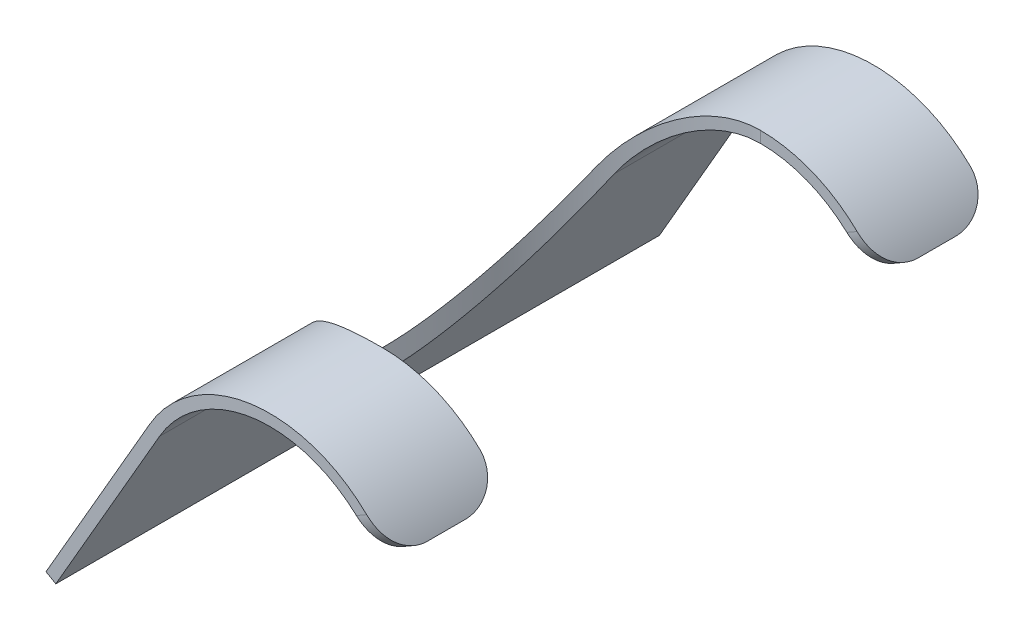
ISO-10303-21;
HEADER;
FILE_DESCRIPTION(('STEP AP214'),'2;1');
FILE_NAME('part.step','',(''),(''),'','','');
FILE_SCHEMA(('AUTOMOTIVE_DESIGN { 1 0 10303 214 1 1 1 1 }'));
ENDSEC;
DATA;
#1=APPLICATION_CONTEXT('core data for automotive mechanical design processes');
#2=APPLICATION_PROTOCOL_DEFINITION('international standard','automotive_design',2000,#1);
#3=PRODUCT_CONTEXT('',#1,'mechanical');
#4=PRODUCT('Part','Part','',(#3));
#5=PRODUCT_RELATED_PRODUCT_CATEGORY('part','',(#4));
#6=PRODUCT_DEFINITION_FORMATION('','',#4);
#7=PRODUCT_DEFINITION_CONTEXT('part definition',#1,'design');
#8=PRODUCT_DEFINITION('design','',#6,#7);
#9=PRODUCT_DEFINITION_SHAPE('','',#8);
#10=(LENGTH_UNIT() NAMED_UNIT(*) SI_UNIT(.MILLI.,.METRE.));
#11=(NAMED_UNIT(*) PLANE_ANGLE_UNIT() SI_UNIT($,.RADIAN.));
#12=(NAMED_UNIT(*) SI_UNIT($,.STERADIAN.) SOLID_ANGLE_UNIT());
#13=UNCERTAINTY_MEASURE_WITH_UNIT(LENGTH_MEASURE(1.E-05),#10,'distance_accuracy_value','');
#14=(GEOMETRIC_REPRESENTATION_CONTEXT(3) GLOBAL_UNCERTAINTY_ASSIGNED_CONTEXT((#13)) GLOBAL_UNIT_ASSIGNED_CONTEXT((#10,
#11,#12)) REPRESENTATION_CONTEXT('',''));
#15=CARTESIAN_POINT('',(0.,0.,0.));
#16=DIRECTION('',(0.,0.,1.));
#17=DIRECTION('',(1.,0.,0.));
#18=AXIS2_PLACEMENT_3D('',#15,#16,#17);
#19=CARTESIAN_POINT('',(-0.500000002018825,7.15593873729671,8.94999999594887));
#20=DIRECTION('',(0.866025403788329,0.499999999993262,0.));
#21=DIRECTION('',(-0.499999999993262,0.866025403788329,0.));
#22=AXIS2_PLACEMENT_3D('',#19,#20,#21);
#23=CYLINDRICAL_SURFACE('',#22,1.00000000405113);
#24=CARTESIAN_POINT('',(2.565077026811,8.92556178494675,9.95));
#25=CARTESIAN_POINT('',(2.58516809545274,8.90600763539458,9.94999981776028));
#26=CARTESIAN_POINT('',(2.6050255348985,8.88622858775811,9.94890721494167));
#27=CARTESIAN_POINT('',(2.64416777003485,8.84634663350885,9.9445059037748));
#28=CARTESIAN_POINT('',(2.66345246111897,8.82624366875768,9.94119679317263));
#29=CARTESIAN_POINT('',(2.72023571833599,8.76569422711802,9.92790836840913));
#30=CARTESIAN_POINT('',(2.75670926997416,8.72496251733051,9.91456809533114));
#31=CARTESIAN_POINT('',(2.82600738758244,8.64417500583196,9.87901547746584));
#32=CARTESIAN_POINT('',(2.85882595104903,8.60412040500736,9.85678880565354));
#33=CARTESIAN_POINT('',(2.92010158941397,8.52628975555175,9.80396854300699));
#34=CARTESIAN_POINT('',(2.94856116028593,8.48851241052897,9.77337976849734));
#35=CARTESIAN_POINT('',(3.00024548200024,8.41741273845879,9.7053165134745));
#36=CARTESIAN_POINT('',(3.02355878256153,8.38401986788639,9.66798266975452));
#37=CARTESIAN_POINT('',(3.06547159989256,8.32216038748116,9.58707963203411));
#38=CARTESIAN_POINT('',(3.08406928748245,8.29369569063405,9.54350802863754));
#39=CARTESIAN_POINT('',(3.1166496565136,8.24262915622129,9.45100255449274));
#40=CARTESIAN_POINT('',(3.13059561191909,8.22007426326099,9.40202989360018));
#41=CARTESIAN_POINT('',(3.15373295200845,8.18202621614994,9.30037673852736));
#42=CARTESIAN_POINT('',(3.16292714460175,8.16652889218879,9.24769845503039));
#43=CARTESIAN_POINT('',(3.17430768237019,8.14718138458603,9.15847258593843));
#44=CARTESIAN_POINT('',(3.17781432909695,8.14116195735259,9.12254285323024));
#45=CARTESIAN_POINT('',(3.18281243475992,8.13254739042067,9.05018851961782));
#46=CARTESIAN_POINT('',(3.18430672275449,8.12994744359368,9.01376468630897));
#47=CARTESIAN_POINT('',(3.18480762,8.1290923,8.97727016284814));
#48=B_SPLINE_CURVE_WITH_KNOTS('',3,(#24,#25,#26,#27,#28,#29,#30,#31,#32,#33,#34,#35,#36,#37,#38,
#39,#40,#41,#42,#43,#44,#45,#46,#47),.UNSPECIFIED.,.F.,.F.,(4,2,2,2,2,2,2,2,2,2,2,4),(0.,
0.0840620784626981,0.168139416725162,0.336104507417472,0.504341497595178,0.672481791646433,
0.837453219375705,1.00248854173718,1.168797593254,1.33500825681516,1.44460043975254,
1.55403839199924),.UNSPECIFIED.);
#49=CARTESIAN_POINT('',(2.565077026811,8.92556178494675,9.95));
#50=VERTEX_POINT('',#49);
#51=CARTESIAN_POINT('',(3.18480762,8.1290923,8.97727016284814));
#52=VERTEX_POINT('',#51);
#53=EDGE_CURVE('E235',#50,#52,#48,.T.);
#54=ORIENTED_EDGE('',*,*,#53,.F.);
#55=DIRECTION('',(0.866025403788326,0.499999999993268,0.));
#56=VECTOR('',#55,1.);
#57=CARTESIAN_POINT('',(2.29414062631406,8.76913658118938,9.95));
#58=LINE('',#57,#56);
#59=CARTESIAN_POINT('',(2.29414062631406,8.76913658118939,9.95));
#60=VERTEX_POINT('',#59);
#61=EDGE_CURVE('E141',#60,#50,#58,.T.);
#62=ORIENTED_EDGE('',*,*,#61,.F.);
#63=CARTESIAN_POINT('',(2.29414062631406,8.76913658118939,9.95));
#64=CARTESIAN_POINT('',(2.31470466713574,8.75010663757751,9.94999980919821));
#65=CARTESIAN_POINT('',(2.33502197653587,8.73082493689715,9.94892472355817));
#66=CARTESIAN_POINT('',(2.3750567268426,8.69188068724999,9.94458585488635));
#67=CARTESIAN_POINT('',(2.39477403405678,8.67221805497848,9.94132158774079));
#68=CARTESIAN_POINT('',(2.45281302404892,8.61289628624455,9.92819631151513));
#69=CARTESIAN_POINT('',(2.49006443620208,8.57286369766963,9.91500298135455));
#70=CARTESIAN_POINT('',(2.56078281480242,8.49323620163832,9.87976554641829));
#71=CARTESIAN_POINT('',(2.59424276812504,8.45364222366939,9.85770537234944));
#72=CARTESIAN_POINT('',(2.65664204394035,8.37653841372539,9.80520899426906));
#73=CARTESIAN_POINT('',(2.68558427895494,8.33902724911928,9.77477822193786));
#74=CARTESIAN_POINT('',(2.73798977189637,8.26842438109076,9.70712230448634));
#75=CARTESIAN_POINT('',(2.76156046422259,8.23525300995497,9.67006311820635));
#76=CARTESIAN_POINT('',(2.80390712805695,8.17369197517111,9.58972569211003));
#77=CARTESIAN_POINT('',(2.8226811226684,8.14530428469058,9.54644489958559));
#78=CARTESIAN_POINT('',(2.85558727262856,8.09424283530653,9.4544748625279));
#79=CARTESIAN_POINT('',(2.86967678220606,8.07162198690413,9.40574105434958));
#80=CARTESIAN_POINT('',(2.89307871074019,8.03335767031896,9.30454710639832));
#81=CARTESIAN_POINT('',(2.9023937784171,8.01771033406638,9.25208905115988));
#82=CARTESIAN_POINT('',(2.91409136079476,7.9978725929767,9.16234423309766));
#83=CARTESIAN_POINT('',(2.91774275914898,7.99161186346191,9.1256614131251));
#84=CARTESIAN_POINT('',(2.92293948820761,7.98266039556129,9.05176630382768));
#85=CARTESIAN_POINT('',(2.92448765890273,7.97996484324297,9.01455479717664));
#86=CARTESIAN_POINT('',(2.92499999992881,7.97909230012332,8.97727014717361));
#87=B_SPLINE_CURVE_WITH_KNOTS('',3,(#63,#64,#65,#66,#67,#68,#69,#70,#71,#72,#73,#74,#75,#76,#77,
#78,#79,#80,#81,#82,#83,#84,#85,#86),.UNSPECIFIED.,.F.,.F.,(4,2,2,2,2,2,2,2,2,2,2,4),(0.,
0.084009682875824,0.168037949711854,0.335922055763564,0.50411179833154,0.672192659011948,
0.836539519331454,1.00095400421219,1.1668266994067,1.33260727342322,1.44456412458009,
1.556369649509),.UNSPECIFIED.);
#88=CARTESIAN_POINT('',(2.925,7.9790923,8.97727015240105));
#89=VERTEX_POINT('',#88);
#90=EDGE_CURVE('E158',#60,#89,#87,.T.);
#91=ORIENTED_EDGE('',*,*,#90,.T.);
#92=DIRECTION('',(0.866025402838329,0.500000001638711,0.));
#93=VECTOR('',#92,1.);
#94=CARTESIAN_POINT('',(3.05490381,8.0540923,8.97727016284814));
#95=LINE('',#94,#93);
#96=EDGE_CURVE('E136',#52,#89,#95,.F.);
#97=ORIENTED_EDGE('',*,*,#96,.F.);
#98=EDGE_LOOP('',(#54,#62,#91,#97));
#99=FACE_BOUND('',#98,.T.);
#100=ADVANCED_FACE('F17',(#99),#23,.T.);
#101=CARTESIAN_POINT('',(3.05490381,8.0540923,6.95));
#102=DIRECTION('',(0.500000001638711,-0.866025402838329,0.));
#103=DIRECTION('',(0.866025402838329,0.500000001638711,0.));
#104=AXIS2_PLACEMENT_3D('',#101,#102,#103);
#105=PLANE('',#104);
#106=DIRECTION('',(0.866025403788329,0.499999999993262,0.));
#107=VECTOR('',#106,1.);
#108=CARTESIAN_POINT('',(-0.00018595007735228,6.29023540498166,7.92272983715184));
#109=LINE('',#108,#107);
#110=CARTESIAN_POINT('',(3.18480762,8.1290923,7.92272983715184));
#111=VERTEX_POINT('',#110);
#112=CARTESIAN_POINT('',(2.9249999998575,7.97909230024682,7.92272984759895));
#113=VERTEX_POINT('',#112);
#114=EDGE_CURVE('E134',#111,#113,#109,.F.);
#115=ORIENTED_EDGE('',*,*,#114,.F.);
#116=DIRECTION('',(0.,0.,1.));
#117=VECTOR('',#116,1.);
#118=CARTESIAN_POINT('',(3.18480762,8.1290923,6.95));
#119=LINE('',#118,#117);
#120=EDGE_CURVE('E350',#52,#111,#119,.F.);
#121=ORIENTED_EDGE('',*,*,#120,.F.);
#122=ORIENTED_EDGE('',*,*,#96,.T.);
#123=DIRECTION('',(0.,0.,1.));
#124=VECTOR('',#123,1.);
#125=CARTESIAN_POINT('',(2.925,7.9790923,6.95));
#126=LINE('',#125,#124);
#127=EDGE_CURVE('E130',#89,#113,#126,.F.);
#128=ORIENTED_EDGE('',*,*,#127,.T.);
#129=EDGE_LOOP('',(#115,#121,#122,#128));
#130=FACE_BOUND('',#129,.T.);
#131=ADVANCED_FACE('F132',(#130),#105,.T.);
#132=CARTESIAN_POINT('',(-0.500000002018825,7.15593873729671,7.95000000405113));
#133=DIRECTION('',(0.866025403788329,0.499999999993262,0.));
#134=DIRECTION('',(-0.499999999993262,0.866025403788329,0.));
#135=AXIS2_PLACEMENT_3D('',#132,#133,#134);
#136=CYLINDRICAL_SURFACE('',#135,1.00000000405113);
#137=CARTESIAN_POINT('',(2.925,7.9790923,7.92272985804603));
#138=CARTESIAN_POINT('',(2.92461497710748,7.97975515604013,7.89463744421071));
#139=CARTESIAN_POINT('',(2.92364129755823,7.98144555683753,7.8665907957685));
#140=CARTESIAN_POINT('',(2.92050606186785,7.98685589158635,7.81076212598566));
#141=CARTESIAN_POINT('',(2.91834455611979,7.9905757394392,7.78298009346966));
#142=CARTESIAN_POINT('',(2.91007027059447,8.00472776247862,7.70036621662128));
#143=CARTESIAN_POINT('',(2.90216667156712,8.01815447775995,7.64618483705058));
#144=CARTESIAN_POINT('',(2.88148244911195,8.05243116735539,7.54120303947536));
#145=CARTESIAN_POINT('',(2.86869916335391,8.07328519355271,7.4904044849221));
#146=CARTESIAN_POINT('',(2.83814154681834,8.12153496046762,7.39364641862384));
#147=CARTESIAN_POINT('',(2.82036824489102,8.14892935250717,7.34768591204469));
#148=CARTESIAN_POINT('',(2.77986290743148,8.2089788437428,7.26211961387637));
#149=CARTESIAN_POINT('',(2.75715261084649,8.24161072100354,7.2224872445201));
#150=CARTESIAN_POINT('',(2.70681771461486,8.31085378802713,7.15048248779734));
#151=CARTESIAN_POINT('',(2.6791936389639,8.34746455332745,7.11810932715452));
#152=CARTESIAN_POINT('',(2.6198077863755,8.42256274633294,7.06194534020721));
#153=CARTESIAN_POINT('',(2.58811539511097,8.46101312393063,7.03803137350619));
#154=CARTESIAN_POINT('',(2.52082114536811,8.53880890752856,6.99863980094296));
#155=CARTESIAN_POINT('',(2.48521995202751,8.57815416035255,6.98316076242387));
#156=CARTESIAN_POINT('',(2.42356885086644,8.64301880940114,6.96460584850809));
#157=CARTESIAN_POINT('',(2.39838097757642,8.66869599993407,6.95910304978404));
#158=CARTESIAN_POINT('',(2.34697796890161,8.71943879272163,6.95180125355583));
#159=CARTESIAN_POINT('',(2.32076503058625,8.74450553424768,6.94999473416754));
#160=CARTESIAN_POINT('',(2.29414062942669,8.76913657830862,6.95));
#161=B_SPLINE_CURVE_WITH_KNOTS('',3,(#137,#138,#139,#140,#141,#142,#143,#144,#145,#146,#147,
#148,#149,#150,#151,#152,#153,#154,#155,#156,#157,#158,#159,#160),.UNSPECIFIED.,.F.,.F.,(4,2,2,
2,2,2,2,2,2,2,2,4),(0.,0.0842568981871175,0.168510222083505,0.336774620485421,0.505130954536078,
0.673452602044459,0.841047576608336,1.00862468987845,1.17365091642329,1.33864910482669,
1.447615814944,1.55636055767743),.UNSPECIFIED.);
#162=CARTESIAN_POINT('',(2.29414062942669,8.76913657830862,6.95));
#163=VERTEX_POINT('',#162);
#164=EDGE_CURVE('E21',#113,#163,#161,.T.);
#165=ORIENTED_EDGE('',*,*,#164,.T.);
#166=DIRECTION('',(0.866025403788329,0.499999999993262,0.));
#167=VECTOR('',#166,1.);
#168=CARTESIAN_POINT('',(-0.499999999993259,7.15593873378833,6.95));
#169=LINE('',#168,#167);
#170=CARTESIAN_POINT('',(2.56507702982753,8.92556178201051,6.95));
#171=VERTEX_POINT('',#170);
#172=EDGE_CURVE('E150',#163,#171,#169,.T.);
#173=ORIENTED_EDGE('',*,*,#172,.T.);
#174=CARTESIAN_POINT('',(3.18480762,8.1290923,7.92272983715184));
#175=CARTESIAN_POINT('',(3.18442267042778,8.12975535445328,7.89463246129579));
#176=CARTESIAN_POINT('',(3.18344857534899,8.13144615648752,7.86658086607313));
#177=CARTESIAN_POINT('',(3.18031307634577,8.13685857261385,7.81074245438584));
#178=CARTESIAN_POINT('',(3.17815172381244,8.14058009880486,7.78295562651356));
#179=CARTESIAN_POINT('',(3.16988123634562,8.15474008188111,7.70032944490068));
#180=CARTESIAN_POINT('',(3.16198458864293,8.16817604456149,7.64614083511628));
#181=CARTESIAN_POINT('',(3.14134906528023,8.20249399207234,7.54114624616715));
#182=CARTESIAN_POINT('',(3.12860759482848,8.2233799666108,7.49034209681819));
#183=CARTESIAN_POINT('',(3.09820579093022,8.27173946629904,7.39357237216359));
#184=CARTESIAN_POINT('',(3.08054645903183,8.29921164997467,7.34760581428089));
#185=CARTESIAN_POINT('',(3.04036783070082,8.35951336318717,7.26199431494545));
#186=CARTESIAN_POINT('',(3.01786651413188,8.39232296603361,7.22232690511095));
#187=CARTESIAN_POINT('',(2.96808807634847,8.46204310516683,7.15025193723569));
#188=CARTESIAN_POINT('',(2.94081120324343,8.49895342836825,7.11784400223522));
#189=CARTESIAN_POINT('',(2.88220118282138,8.57489634428194,7.06155100894152));
#190=CARTESIAN_POINT('',(2.85092468363286,8.61389555756343,7.03756174905091));
#191=CARTESIAN_POINT('',(2.78460101774433,8.69297742311017,6.99809008375617));
#192=CARTESIAN_POINT('',(2.7495548482208,8.7330597867634,6.98260543524519));
#193=CARTESIAN_POINT('',(2.68942655074896,8.79877101017756,6.9642792297853));
#194=CARTESIAN_POINT('',(2.66519566409774,8.82450594716837,6.95890401695498));
#195=CARTESIAN_POINT('',(2.61579291579234,8.87547224165768,6.95176570704237));
#196=CARTESIAN_POINT('',(2.59062301160846,8.90070449509861,6.94999548131208));
#197=CARTESIAN_POINT('',(2.56507702982753,8.92556178201051,6.95));
#198=B_SPLINE_CURVE_WITH_KNOTS('',3,(#174,#175,#176,#177,#178,#179,#180,#181,#182,#183,#184,
#185,#186,#187,#188,#189,#190,#191,#192,#193,#194,#195,#196,#197),.UNSPECIFIED.,.F.,.F.,(4,2,2,
2,2,2,2,2,2,2,2,4),(0.,0.0842717694749957,0.168539891486708,0.336828547388573,0.505207462627632,
0.673552111668573,0.841282109500406,1.00900339566692,1.17456872368317,1.34009036254438,
1.447166292486,1.55403027972248),.UNSPECIFIED.);
#199=EDGE_CURVE('E148',#111,#171,#198,.T.);
#200=ORIENTED_EDGE('',*,*,#199,.F.);
#201=ORIENTED_EDGE('',*,*,#114,.T.);
#202=EDGE_LOOP('',(#165,#173,#200,#201));
#203=FACE_BOUND('',#202,.T.);
#204=ADVANCED_FACE('F145',(#203),#136,.T.);
#205=CARTESIAN_POINT('',(5.,6.5,9.95));
#206=DIRECTION('',(0.,0.,1.));
#207=DIRECTION('',(1.,0.,0.));
#208=AXIS2_PLACEMENT_3D('',#205,#206,#207);
#209=PLANE('',#208);
#210=DIRECTION('',(0.,1.,0.));
#211=VECTOR('',#210,1.);
#212=CARTESIAN_POINT('',(0.,6.5,9.95));
#213=LINE('',#212,#211);
#214=CARTESIAN_POINT('',(0.,9.96784184,9.95));
#215=VERTEX_POINT('',#214);
#216=CARTESIAN_POINT('',(0.,9.66784184,9.95));
#217=VERTEX_POINT('',#216);
#218=EDGE_CURVE('E194',#215,#217,#213,.F.);
#219=ORIENTED_EDGE('',*,*,#218,.T.);
#220=CARTESIAN_POINT('',(0.,6.29034276786103,9.95));
#221=DIRECTION('',(0.,0.,1.));
#222=DIRECTION('',(1.,0.,0.));
#223=AXIS2_PLACEMENT_3D('',#220,#221,#222);
#224=CIRCLE('',#223,3.37749907213897);
#225=EDGE_CURVE('E156',#217,#60,#224,.F.);
#226=ORIENTED_EDGE('',*,*,#225,.T.);
#227=ORIENTED_EDGE('',*,*,#61,.T.);
#228=CARTESIAN_POINT('',(0.,6.29034276982749,9.95));
#229=DIRECTION('',(0.,0.,1.));
#230=DIRECTION('',(1.,0.,0.));
#231=AXIS2_PLACEMENT_3D('',#228,#229,#230);
#232=CIRCLE('',#231,3.67749907017251);
#233=EDGE_CURVE('E394',#215,#50,#232,.F.);
#234=ORIENTED_EDGE('',*,*,#233,.F.);
#235=EDGE_LOOP('',(#219,#226,#227,#234));
#236=FACE_BOUND('',#235,.T.);
#237=ADVANCED_FACE('F181',(#236),#209,.T.);
#238=CARTESIAN_POINT('',(0.,6.29034276786103,6.95));
#239=DIRECTION('',(0.,0.,1.));
#240=DIRECTION('',(1.,0.,0.));
#241=AXIS2_PLACEMENT_3D('',#238,#239,#240);
#242=CYLINDRICAL_SURFACE('',#241,3.37749907213897);
#243=ORIENTED_EDGE('',*,*,#225,.F.);
#244=CARTESIAN_POINT('',(0.,9.66784184,9.95));
#245=CARTESIAN_POINT('',(-0.084958345531506,9.66785863006401,9.94998167591942));
#246=CARTESIAN_POINT('',(-0.169904048258457,9.66463680960258,9.95216482562147));
#247=CARTESIAN_POINT('',(-0.339050587228251,9.65184601710669,9.96079531076645));
#248=CARTESIAN_POINT('',(-0.423251824054296,9.64228069938215,9.9672401911403));
#249=CARTESIAN_POINT('',(-0.589731963179529,9.61701726811508,9.984198906767));
#250=CARTESIAN_POINT('',(-0.672019942965019,9.60136049790264,9.99468530738003));
#251=CARTESIAN_POINT('',(-0.834649709007323,9.56415202801868,10.0194689239346));
#252=CARTESIAN_POINT('',(-0.914991308739945,9.54259976578781,10.0337665035429));
#253=CARTESIAN_POINT('',(-1.15196812758825,9.46960232818252,10.0818557588095));
#254=CARTESIAN_POINT('',(-1.30504568745055,9.40974004603339,10.1208966376904));
#255=CARTESIAN_POINT('',(-1.59851664632472,9.270070515831,10.2099170759606));
#256=CARTESIAN_POINT('',(-1.73888509035974,9.19022513903633,10.2599175238394));
#257=CARTESIAN_POINT('',(-2.01638583954306,9.00545191549999,10.3719602163071));
#258=CARTESIAN_POINT('',(-2.15220045713866,8.89895700955954,10.4346684046473));
#259=CARTESIAN_POINT('',(-2.40502299339944,8.66788078470656,10.5641117667837));
#260=CARTESIAN_POINT('',(-2.5220440209995,8.54331218903955,10.6308440885772));
#261=CARTESIAN_POINT('',(-2.68375722843802,8.34278791640753,10.7308069970213));
#262=CARTESIAN_POINT('',(-2.73582353053487,8.27286921028747,10.7644534084688));
#263=CARTESIAN_POINT('',(-2.8345046274771,8.12899994201524,10.8306417633896));
#264=CARTESIAN_POINT('',(-2.881128832683,8.05505667382583,10.8631855421959));
#265=CARTESIAN_POINT('',(-2.92500000000001,7.97909229999999,10.8948335422575));
#266=B_SPLINE_CURVE_WITH_KNOTS('',3,(#244,#245,#246,#247,#248,#249,#250,#251,#252,#253,#254,
#255,#256,#257,#258,#259,#260,#261,#262,#263,#264,#265),.UNSPECIFIED.,.F.,.F.,(4,2,2,2,2,2,2,2,
2,2,4),(0.,0.254765201277191,0.509383766843172,0.762303537240699,1.01524745016067,
1.51965739838996,2.02503722303324,2.57390212690939,3.12238250709262,3.40249334438054,
3.68211241006676),.UNSPECIFIED.);
#267=CARTESIAN_POINT('',(-2.925,7.9790923,10.8948335422575));
#268=VERTEX_POINT('',#267);
#269=EDGE_CURVE('E185',#217,#268,#266,.T.);
#270=ORIENTED_EDGE('',*,*,#269,.T.);
#271=DIRECTION('',(0.,0.,1.));
#272=VECTOR('',#271,1.);
#273=CARTESIAN_POINT('',(-2.925,7.9790923,6.95));
#274=LINE('',#273,#272);
#275=CARTESIAN_POINT('',(-2.925,7.9790923,6.95));
#276=VERTEX_POINT('',#275);
#277=EDGE_CURVE('E161',#276,#268,#274,.T.);
#278=ORIENTED_EDGE('',*,*,#277,.F.);
#279=CARTESIAN_POINT('',(0.,6.29034276786103,6.95));
#280=DIRECTION('',(0.,0.,1.));
#281=DIRECTION('',(1.,0.,0.));
#282=AXIS2_PLACEMENT_3D('',#279,#280,#281);
#283=CIRCLE('',#282,3.37749907213897);
#284=EDGE_CURVE('E155',#276,#163,#283,.F.);
#285=ORIENTED_EDGE('',*,*,#284,.T.);
#286=ORIENTED_EDGE('',*,*,#164,.F.);
#287=ORIENTED_EDGE('',*,*,#127,.F.);
#288=ORIENTED_EDGE('',*,*,#90,.F.);
#289=EDGE_LOOP('',(#243,#270,#278,#285,#286,#287,#288));
#290=FACE_BOUND('',#289,.T.);
#291=ADVANCED_FACE('F153',(#290),#242,.F.);
#292=CARTESIAN_POINT('',(-4.30004636,5.597549205,6.95));
#293=DIRECTION('',(0.866015670594667,-0.500016858000277,0.));
#294=DIRECTION('',(0.500016858000277,0.866015670594667,0.));
#295=AXIS2_PLACEMENT_3D('',#292,#293,#294);
#296=PLANE('',#295);
#297=DIRECTION('',(0.500016858000277,0.866015670594667,0.));
#298=VECTOR('',#297,1.);
#299=CARTESIAN_POINT('',(-5.67509272,3.21600611,6.95));
#300=LINE('',#299,#298);
#301=CARTESIAN_POINT('',(-5.67509272,3.21600611,6.95));
#302=VERTEX_POINT('',#301);
#303=EDGE_CURVE('E344',#302,#276,#300,.T.);
#304=ORIENTED_EDGE('',*,*,#303,.T.);
#305=ORIENTED_EDGE('',*,*,#277,.T.);
#306=CARTESIAN_POINT('',(0.,13.0451131670164,14.95));
#307=DIRECTION('',(0.866015670594667,-0.500016858000277,0.));
#308=DIRECTION('',(0.500016858000277,0.866015670594667,0.));
#309=AXIS2_PLACEMENT_3D('',#306,#307,#308);
#310=ELLIPSE('',#309,9.99966285136177,5.);
#311=CARTESIAN_POINT('',(-2.925,7.9790923,19.0051664577425));
#312=VERTEX_POINT('',#311);
#313=EDGE_CURVE('E193',#268,#312,#310,.F.);
#314=ORIENTED_EDGE('',*,*,#313,.T.);
#315=DIRECTION('',(0.,0.,1.));
#316=VECTOR('',#315,1.);
#317=CARTESIAN_POINT('',(-2.925,7.9790923,6.95));
#318=LINE('',#317,#316);
#319=CARTESIAN_POINT('',(-2.925,7.9790923,22.95));
#320=VERTEX_POINT('',#319);
#321=EDGE_CURVE('E362',#312,#320,#318,.T.);
#322=ORIENTED_EDGE('',*,*,#321,.T.);
#323=DIRECTION('',(0.500016858000277,0.866015670594667,0.));
#324=VECTOR('',#323,1.);
#325=CARTESIAN_POINT('',(-5.67509272,3.21600611,22.95));
#326=LINE('',#325,#324);
#327=CARTESIAN_POINT('',(-5.67509272,3.21600611,22.95));
#328=VERTEX_POINT('',#327);
#329=EDGE_CURVE('E320',#328,#320,#326,.T.);
#330=ORIENTED_EDGE('',*,*,#329,.F.);
#331=DIRECTION('',(0.,0.,1.));
#332=VECTOR('',#331,1.);
#333=CARTESIAN_POINT('',(-5.67509272,3.21600611,6.95));
#334=LINE('',#333,#332);
#335=EDGE_CURVE('E329',#302,#328,#334,.T.);
#336=ORIENTED_EDGE('',*,*,#335,.F.);
#337=EDGE_LOOP('',(#304,#305,#314,#322,#330,#336));
#338=FACE_BOUND('',#337,.T.);
#339=ADVANCED_FACE('F180',(#338),#296,.T.);
#340=CARTESIAN_POINT('',(0.,6.29034276786103,6.95));
#341=DIRECTION('',(0.,0.,1.));
#342=DIRECTION('',(1.,0.,0.));
#343=AXIS2_PLACEMENT_3D('',#340,#341,#342);
#344=CYLINDRICAL_SURFACE('',#343,3.37749907213897);
#345=CARTESIAN_POINT('',(0.,6.29034276786103,22.95));
#346=DIRECTION('',(0.,0.,1.));
#347=DIRECTION('',(1.,0.,0.));
#348=AXIS2_PLACEMENT_3D('',#345,#346,#347);
#349=CIRCLE('',#348,3.37749907213897);
#350=CARTESIAN_POINT('',(2.29414062942669,8.76913657830862,22.95));
#351=VERTEX_POINT('',#350);
#352=EDGE_CURVE('E323',#320,#351,#349,.F.);
#353=ORIENTED_EDGE('',*,*,#352,.F.);
#354=ORIENTED_EDGE('',*,*,#321,.F.);
#355=CARTESIAN_POINT('',(-2.925,7.9790923,19.0051664577425));
#356=CARTESIAN_POINT('',(-2.87502870149024,8.06561540691254,19.0412222728047));
#357=CARTESIAN_POINT('',(-2.82146642479885,8.14954949227385,19.0784422625478));
#358=CARTESIAN_POINT('',(-2.70743756142987,8.31201489264485,19.154097608895));
#359=CARTESIAN_POINT('',(-2.64697073254314,8.39054601796574,19.192533008101));
#360=CARTESIAN_POINT('',(-2.51884935271298,8.54264493561733,19.2698441986433));
#361=CARTESIAN_POINT('',(-2.45113591042172,8.61616263516136,19.3087208764687));
#362=CARTESIAN_POINT('',(-2.30919293850662,8.75714944350827,19.3855539233418));
#363=CARTESIAN_POINT('',(-2.23496334949328,8.82461849717122,19.4235102839974));
#364=CARTESIAN_POINT('',(-2.08001675546246,8.95327269992052,19.4976285991174));
#365=CARTESIAN_POINT('',(-1.9992828920603,9.01444051781644,19.5337854702308));
#366=CARTESIAN_POINT('',(-1.83180761621845,9.12976417826853,19.6032457367277));
#367=CARTESIAN_POINT('',(-1.74506721567382,9.18392119751353,19.6365496106386));
#368=CARTESIAN_POINT('',(-1.56646215414609,9.28435921988885,19.6992213441191));
#369=CARTESIAN_POINT('',(-1.47462804970368,9.33068160221122,19.7286096969009));
#370=CARTESIAN_POINT('',(-1.28603343282961,9.4151274621061,19.7827766856144));
#371=CARTESIAN_POINT('',(-1.18927693602281,9.4532574943367,19.807559004652));
#372=CARTESIAN_POINT('',(-1.00458434670038,9.51625905485465,19.8488312229553));
#373=CARTESIAN_POINT('',(-0.917165614281746,9.54221551658465,19.8659834694633));
#374=CARTESIAN_POINT('',(-0.739803256652026,9.5870923239007,19.8957838245283));
#375=CARTESIAN_POINT('',(-0.649860306311328,9.60601453123736,19.9084331248389));
#376=CARTESIAN_POINT('',(-0.467130192285174,9.63667768250014,19.9289877101639));
#377=CARTESIAN_POINT('',(-0.374322138138345,9.64833277448022,19.9368362604497));
#378=CARTESIAN_POINT('',(-0.187682554471021,9.66393138390392,19.9473587936073));
#379=CARTESIAN_POINT('',(-0.0938501305602867,9.66786751140527,19.9500278177058));
#380=CARTESIAN_POINT('',(0.,9.66784184,19.95));
#381=B_SPLINE_CURVE_WITH_KNOTS('',3,(#355,#356,#357,#358,#359,#360,#361,#362,#363,#364,#365,
#366,#367,#368,#369,#370,#371,#372,#373,#374,#375,#376,#377,#378,#379,#380),.UNSPECIFIED.,.F.,
.F.,(4,2,2,2,2,2,2,2,2,2,2,2,4),(0.,0.318537691970225,0.637086561559451,0.958455417696199,
1.27982720315857,1.60206054241145,1.92423972787114,2.24466022843441,2.56482339952133,
2.84280616641905,3.12071530736468,3.40184830806753,3.68325032728434),.UNSPECIFIED.);
#382=CARTESIAN_POINT('',(0.,9.66784184,19.95));
#383=VERTEX_POINT('',#382);
#384=EDGE_CURVE('E228',#312,#383,#381,.T.);
#385=ORIENTED_EDGE('',*,*,#384,.T.);
#386=CARTESIAN_POINT('',(0.,6.29034276786103,19.95));
#387=DIRECTION('',(0.,0.,1.));
#388=DIRECTION('',(1.,0.,0.));
#389=AXIS2_PLACEMENT_3D('',#386,#387,#388);
#390=CIRCLE('',#389,3.37749907213897);
#391=CARTESIAN_POINT('',(2.29414062631406,8.76913658118939,19.95));
#392=VERTEX_POINT('',#391);
#393=EDGE_CURVE('E196',#383,#392,#390,.F.);
#394=ORIENTED_EDGE('',*,*,#393,.T.);
#395=CARTESIAN_POINT('',(2.925,7.9790923,20.922729858046));
#396=CARTESIAN_POINT('',(2.92461497710748,7.97975515604013,20.8946374442106));
#397=CARTESIAN_POINT('',(2.92364129755822,7.98144555683754,20.8665907957684));
#398=CARTESIAN_POINT('',(2.92050606186784,7.98685589158636,20.8107621259855));
#399=CARTESIAN_POINT('',(2.91834455611977,7.99057573943923,20.7829800934694));
#400=CARTESIAN_POINT('',(2.91007027059445,8.00472776247866,20.7003662166211));
#401=CARTESIAN_POINT('',(2.90216667156711,8.01815447775997,20.6461848370505));
#402=CARTESIAN_POINT('',(2.88148244911197,8.05243116735536,20.5412030394754));
#403=CARTESIAN_POINT('',(2.86869916335395,8.07328519355264,20.4904044849222));
#404=CARTESIAN_POINT('',(2.8381415468184,8.12153496046753,20.393646418624));
#405=CARTESIAN_POINT('',(2.82036824489106,8.14892935250712,20.3476859120447));
#406=CARTESIAN_POINT('',(2.77986290743137,8.20897884374297,20.2621196138761));
#407=CARTESIAN_POINT('',(2.75715261084624,8.2416107210039,20.2224872445196));
#408=CARTESIAN_POINT('',(2.70681771461458,8.31085378802751,20.150482487797));
#409=CARTESIAN_POINT('',(2.67919363896378,8.34746455332762,20.1181093271543));
#410=CARTESIAN_POINT('',(2.619807786376,8.42256274633229,20.0619453402077));
#411=CARTESIAN_POINT('',(2.58811539511198,8.46101312392934,20.038031373507));
#412=CARTESIAN_POINT('',(2.52082114536956,8.538808907527,19.9986398009435));
#413=CARTESIAN_POINT('',(2.48521995202875,8.57815416035138,19.9831607624241));
#414=CARTESIAN_POINT('',(2.42356885038934,8.64301880990301,19.9646058483646));
#415=CARTESIAN_POINT('',(2.39838097659588,8.6686960009334,19.95910304957));
#416=CARTESIAN_POINT('',(2.34697796687811,8.71943879468754,19.9518012533431));
#417=CARTESIAN_POINT('',(2.32076502802328,8.74450553668274,19.9499947340265));
#418=CARTESIAN_POINT('',(2.29414062631406,8.76913658118938,19.95));
#419=B_SPLINE_CURVE_WITH_KNOTS('',3,(#395,#396,#397,#398,#399,#400,#401,#402,#403,#404,#405,
#406,#407,#408,#409,#410,#411,#412,#413,#414,#415,#416,#417,#418),.UNSPECIFIED.,.F.,.F.,(4,2,2,
2,2,2,2,2,2,2,2,4),(0.,0.0842568981872326,0.168510222083734,0.336774620485419,0.505130954535799,
0.673452602044457,0.841047576609227,1.00862468987845,1.17365091642028,1.33864910482669,
1.44761581706246,1.55636056191259),.UNSPECIFIED.);
#420=CARTESIAN_POINT('',(2.92499999992875,7.97909230012341,20.9227298475989));
#421=VERTEX_POINT('',#420);
#422=EDGE_CURVE('E249',#421,#392,#419,.T.);
#423=ORIENTED_EDGE('',*,*,#422,.F.);
#424=DIRECTION('',(0.,0.,1.));
#425=VECTOR('',#424,1.);
#426=CARTESIAN_POINT('',(2.925,7.9790923,6.95));
#427=LINE('',#426,#425);
#428=CARTESIAN_POINT('',(2.9249999999288,7.97909230012332,21.9772701576207));
#429=VERTEX_POINT('',#428);
#430=EDGE_CURVE('E358',#429,#421,#427,.F.);
#431=ORIENTED_EDGE('',*,*,#430,.F.);
#432=CARTESIAN_POINT('',(2.29414062942669,8.76913657830862,22.95));
#433=CARTESIAN_POINT('',(2.31470467021361,8.75010663468099,22.9499998090898));
#434=CARTESIAN_POINT('',(2.33502197957585,8.73082493398827,22.9489247233413));
#435=CARTESIAN_POINT('',(2.37505672980091,8.69188068432403,22.9445858544531));
#436=CARTESIAN_POINT('',(2.39477403697132,8.67221805204779,22.9413215871996));
#437=CARTESIAN_POINT('',(2.45281302682332,8.612896283313,22.928196310653));
#438=CARTESIAN_POINT('',(2.49006443887222,8.57286369475437,22.915002980282));
#439=CARTESIAN_POINT('',(2.56078281724846,8.49323619879245,22.8797655449409));
#440=CARTESIAN_POINT('',(2.59424277045129,8.45364222087669,22.8577053706779));
#441=CARTESIAN_POINT('',(2.65664204602008,8.37653841107383,22.8052089922343));
#442=CARTESIAN_POINT('',(2.68558428090795,8.33902724655569,22.7747782197339));
#443=CARTESIAN_POINT('',(2.73798977361092,8.26842437871458,22.7071223019623));
#444=CARTESIAN_POINT('',(2.7615604658232,8.23525300767922,22.6700631155274));
#445=CARTESIAN_POINT('',(2.80390712942981,8.17369197312407,22.5897256891478));
#446=CARTESIAN_POINT('',(2.82268112392737,8.14530428277192,22.5464448964949));
#447=CARTESIAN_POINT('',(2.85558727366602,8.0942428336613,22.4544748591962));
#448=CARTESIAN_POINT('',(2.86967678313447,8.07162198540595,22.4057410509041));
#449=CARTESIAN_POINT('',(2.89307871145049,8.0333576691376,22.3045471027583));
#450=CARTESIAN_POINT('',(2.90239377901865,8.01771033305433,22.2520890474392));
#451=CARTESIAN_POINT('',(2.9140913610216,7.99787259258652,22.1623442307525));
#452=CARTESIAN_POINT('',(2.91774275919674,7.99161186337873,22.1256614122664));
#453=CARTESIAN_POINT('',(2.92293948806825,7.98266039580212,22.0517663059881));
#454=CARTESIAN_POINT('',(2.92448765875531,7.97996484350085,22.0145548008697));
#455=CARTESIAN_POINT('',(2.92499999985761,7.97909230024663,21.9772701523932));
#456=B_SPLINE_CURVE_WITH_KNOTS('',3,(#432,#433,#434,#435,#436,#437,#438,#439,#440,#441,#442,
#443,#444,#445,#446,#447,#448,#449,#450,#451,#452,#453,#454,#455),.UNSPECIFIED.,.F.,.F.,(4,2,2,
2,2,2,2,2,2,2,2,4),(0.,0.084009682831384,0.168037949622663,0.335922055581003,0.504111798052604,
0.672192658637735,0.836539518942773,1.00095400381169,1.16682669904351,1.33260727308672,
1.44456411969058,1.55636964006146),.UNSPECIFIED.);
#457=EDGE_CURVE('E168',#351,#429,#456,.T.);
#458=ORIENTED_EDGE('',*,*,#457,.F.);
#459=EDGE_LOOP('',(#353,#354,#385,#394,#423,#431,#458));
#460=FACE_BOUND('',#459,.T.);
#461=ADVANCED_FACE('F240',(#460),#344,.F.);
#462=CARTESIAN_POINT('',(-0.500000002018825,7.15593873729671,21.9499999959489));
#463=DIRECTION('',(0.866025403788329,0.499999999993262,0.));
#464=DIRECTION('',(-0.499999999993262,0.866025403788329,0.));
#465=AXIS2_PLACEMENT_3D('',#462,#463,#464);
#466=CYLINDRICAL_SURFACE('',#465,1.00000000405113);
#467=CARTESIAN_POINT('',(2.56507702982753,8.92556178201051,22.95));
#468=CARTESIAN_POINT('',(2.58516809843795,8.90600763244404,22.949999817651));
#469=CARTESIAN_POINT('',(2.60502553784927,8.88622858479673,22.9489072147231));
#470=CARTESIAN_POINT('',(2.64416777291089,8.84634663053338,22.9445059033381));
#471=CARTESIAN_POINT('',(2.66345246395472,8.82624366577897,22.9411967926273));
#472=CARTESIAN_POINT('',(2.72023572104217,8.76569422414277,22.9279083675405));
#473=CARTESIAN_POINT('',(2.75670927258318,8.72496251437423,22.9145680942504));
#474=CARTESIAN_POINT('',(2.82600738998136,8.64417500294965,22.8790154759766));
#475=CARTESIAN_POINT('',(2.85882595333503,8.60412040218008,22.8567888039681));
#476=CARTESIAN_POINT('',(2.9201015914663,8.5262897528686,22.8039685409531));
#477=CARTESIAN_POINT('',(2.94856116221747,8.48851240793492,22.7733797662712));
#478=CARTESIAN_POINT('',(3.00024548370125,8.41741273605673,22.7053165109227));
#479=CARTESIAN_POINT('',(3.02355878415097,8.38401986558816,22.667982667046));
#480=CARTESIAN_POINT('',(3.06547160125781,8.32216038541841,22.5870796290391));
#481=CARTESIAN_POINT('',(3.08406928873506,8.293695688703,22.5435080255129));
#482=CARTESIAN_POINT('',(3.11664965754542,8.24262915457133,22.4510025511275));
#483=CARTESIAN_POINT('',(3.13059561284163,8.22007426176208,22.4020298901231));
#484=CARTESIAN_POINT('',(3.15373295271239,8.18202621497409,22.3003767348592));
#485=CARTESIAN_POINT('',(3.16292714519651,8.16652889118475,22.2476984512832));
#486=CARTESIAN_POINT('',(3.17430768270228,8.14718138401678,22.15847258273));
#487=CARTESIAN_POINT('',(3.17781432931217,8.14116195698238,22.1225428506464));
#488=CARTESIAN_POINT('',(3.18281243481362,8.13254739032771,22.0501885183109));
#489=CARTESIAN_POINT('',(3.18430672276355,8.12994744357895,22.0137646856544));
#490=CARTESIAN_POINT('',(3.18480762,8.1290923,21.9772701628481));
#491=B_SPLINE_CURVE_WITH_KNOTS('',3,(#467,#468,#469,#470,#471,#472,#473,#474,#475,#476,#477,
#478,#479,#480,#481,#482,#483,#484,#485,#486,#487,#488,#489,#490),.UNSPECIFIED.,.F.,.F.,(4,2,2,
2,2,2,2,2,2,2,2,4),(0.,0.0840620784252587,0.168139416650017,0.3361045072634,0.504341497359599,
0.672481791330606,0.83745321904861,1.00248854139991,1.16879759294643,1.3350082565326,
1.44460043751058,1.55403838779627),.UNSPECIFIED.);
#492=CARTESIAN_POINT('',(2.56507702982753,8.92556178201051,22.95));
#493=VERTEX_POINT('',#492);
#494=CARTESIAN_POINT('',(3.18480762,8.1290923,21.9772701628481));
#495=VERTEX_POINT('',#494);
#496=EDGE_CURVE('E272',#493,#495,#491,.T.);
#497=ORIENTED_EDGE('',*,*,#496,.F.);
#498=DIRECTION('',(0.866025403788318,0.49999999999328,0.));
#499=VECTOR('',#498,1.);
#500=CARTESIAN_POINT('',(2.29414062942669,8.76913657830862,22.95));
#501=LINE('',#500,#499);
#502=EDGE_CURVE('E327',#351,#493,#501,.T.);
#503=ORIENTED_EDGE('',*,*,#502,.F.);
#504=ORIENTED_EDGE('',*,*,#457,.T.);
#505=DIRECTION('',(0.866025402838329,0.500000001638711,0.));
#506=VECTOR('',#505,1.);
#507=CARTESIAN_POINT('',(3.05490381,8.0540923,21.9772701628481));
#508=LINE('',#507,#506);
#509=EDGE_CURVE('E359',#495,#429,#508,.F.);
#510=ORIENTED_EDGE('',*,*,#509,.F.);
#511=EDGE_LOOP('',(#497,#503,#504,#510));
#512=FACE_BOUND('',#511,.T.);
#513=ADVANCED_FACE('F243',(#512),#466,.T.);
#514=CARTESIAN_POINT('',(3.05490381,8.0540923,6.95));
#515=DIRECTION('',(0.500000001638711,-0.866025402838329,0.));
#516=DIRECTION('',(0.866025402838329,0.500000001638711,0.));
#517=AXIS2_PLACEMENT_3D('',#514,#515,#516);
#518=PLANE('',#517);
#519=DIRECTION('',(0.866025403788329,0.499999999993262,0.));
#520=VECTOR('',#519,1.);
#521=CARTESIAN_POINT('',(-0.000185950077352388,6.29023540498166,20.9227298371518));
#522=LINE('',#521,#520);
#523=CARTESIAN_POINT('',(3.18480762,8.1290923,20.9227298371518));
#524=VERTEX_POINT('',#523);
#525=EDGE_CURVE('E255',#524,#421,#522,.F.);
#526=ORIENTED_EDGE('',*,*,#525,.F.);
#527=DIRECTION('',(0.,0.,1.));
#528=VECTOR('',#527,1.);
#529=CARTESIAN_POINT('',(3.18480762,8.1290923,6.95));
#530=LINE('',#529,#528);
#531=EDGE_CURVE('E271',#495,#524,#530,.F.);
#532=ORIENTED_EDGE('',*,*,#531,.F.);
#533=ORIENTED_EDGE('',*,*,#509,.T.);
#534=ORIENTED_EDGE('',*,*,#430,.T.);
#535=EDGE_LOOP('',(#526,#532,#533,#534));
#536=FACE_BOUND('',#535,.T.);
#537=ADVANCED_FACE('F259',(#536),#518,.T.);
#538=CARTESIAN_POINT('',(-0.500000002018825,7.15593873729671,20.9500000040511));
#539=DIRECTION('',(0.866025403788329,0.499999999993262,0.));
#540=DIRECTION('',(-0.499999999993262,0.866025403788329,0.));
#541=AXIS2_PLACEMENT_3D('',#538,#539,#540);
#542=CYLINDRICAL_SURFACE('',#541,1.00000000405113);
#543=ORIENTED_EDGE('',*,*,#422,.T.);
#544=DIRECTION('',(0.866025403788326,0.499999999993268,0.));
#545=VECTOR('',#544,1.);
#546=CARTESIAN_POINT('',(2.29414062631406,8.76913658118938,19.95));
#547=LINE('',#546,#545);
#548=CARTESIAN_POINT('',(2.565077026811,8.92556178494675,19.95));
#549=VERTEX_POINT('',#548);
#550=EDGE_CURVE('E354',#392,#549,#547,.T.);
#551=ORIENTED_EDGE('',*,*,#550,.T.);
#552=CARTESIAN_POINT('',(3.18480762,8.1290923,20.9227298371518));
#553=CARTESIAN_POINT('',(3.18442267042777,8.12975535445328,20.8946324612957));
#554=CARTESIAN_POINT('',(3.18344857534899,8.13144615648753,20.866580866073));
#555=CARTESIAN_POINT('',(3.18031307634576,8.13685857261387,20.8107424543857));
#556=CARTESIAN_POINT('',(3.17815172381243,8.14058009880488,20.7829556265133));
#557=CARTESIAN_POINT('',(3.1698812363456,8.15474008188114,20.7003294449005));
#558=CARTESIAN_POINT('',(3.16198458864292,8.16817604456151,20.6461408351162));
#559=CARTESIAN_POINT('',(3.14134906528025,8.20249399207231,20.5411462461672));
#560=CARTESIAN_POINT('',(3.12860759482852,8.22337996661074,20.4903420968183));
#561=CARTESIAN_POINT('',(3.09820579093027,8.27173946629895,20.3935723721637));
#562=CARTESIAN_POINT('',(3.08054645903186,8.29921164997463,20.3476058142809));
#563=CARTESIAN_POINT('',(3.04036783070071,8.35951336318733,20.2619943149452));
#564=CARTESIAN_POINT('',(3.01786651413163,8.39232296603397,20.2223269051105));
#565=CARTESIAN_POINT('',(2.96808807634819,8.46204310516721,20.1502519372353));
#566=CARTESIAN_POINT('',(2.94081120324331,8.49895342836842,20.117844002235));
#567=CARTESIAN_POINT('',(2.88220118282186,8.5748963442813,20.061551008942));
#568=CARTESIAN_POINT('',(2.85092468363383,8.61389555756217,20.0375617490517));
#569=CARTESIAN_POINT('',(2.78460101774572,8.69297742310861,19.9980900837567));
#570=CARTESIAN_POINT('',(2.749554848222,8.73305978676222,19.9826054352454));
#571=CARTESIAN_POINT('',(2.68942655028478,8.79877101068475,19.9642792296439));
#572=CARTESIAN_POINT('',(2.66519566314494,8.82450594818009,19.9589040167437));
#573=CARTESIAN_POINT('',(2.61579291382895,8.87547224365426,19.9517657068321));
#574=CARTESIAN_POINT('',(2.59062300912314,8.90070449757556,19.9499954811725));
#575=CARTESIAN_POINT('',(2.565077026811,8.92556178494675,19.95));
#576=B_SPLINE_CURVE_WITH_KNOTS('',3,(#552,#553,#554,#555,#556,#557,#558,#559,#560,#561,#562,
#563,#564,#565,#566,#567,#568,#569,#570,#571,#572,#573,#574,#575),.UNSPECIFIED.,.F.,.F.,(4,2,2,
2,2,2,2,2,2,2,2,4),(0.,0.0842717694750987,0.168539891486922,0.336828547388576,0.505207462627363,
0.673552111668577,0.84128210950128,1.00900339566693,1.17456872368021,1.34009036254439,
1.44716629458875,1.55403028392633),.UNSPECIFIED.);
#577=EDGE_CURVE('E263',#524,#549,#576,.T.);
#578=ORIENTED_EDGE('',*,*,#577,.F.);
#579=ORIENTED_EDGE('',*,*,#525,.T.);
#580=EDGE_LOOP('',(#543,#551,#578,#579));
#581=FACE_BOUND('',#580,.T.);
#582=ADVANCED_FACE('F256',(#581),#542,.T.);
#583=CARTESIAN_POINT('',(5.,6.5,19.95));
#584=DIRECTION('',(0.,0.,1.));
#585=DIRECTION('',(1.,0.,0.));
#586=AXIS2_PLACEMENT_3D('',#583,#584,#585);
#587=PLANE('',#586);
#588=ORIENTED_EDGE('',*,*,#393,.F.);
#589=DIRECTION('',(0.,1.,0.));
#590=VECTOR('',#589,1.);
#591=CARTESIAN_POINT('',(0.,6.5,19.95));
#592=LINE('',#591,#590);
#593=CARTESIAN_POINT('',(0.,9.96784184,19.95));
#594=VERTEX_POINT('',#593);
#595=EDGE_CURVE('E234',#383,#594,#592,.T.);
#596=ORIENTED_EDGE('',*,*,#595,.T.);
#597=CARTESIAN_POINT('',(0.,6.29034276982749,19.95));
#598=DIRECTION('',(0.,0.,1.));
#599=DIRECTION('',(1.,0.,0.));
#600=AXIS2_PLACEMENT_3D('',#597,#598,#599);
#601=CIRCLE('',#600,3.67749907017251);
#602=EDGE_CURVE('E270',#549,#594,#601,.T.);
#603=ORIENTED_EDGE('',*,*,#602,.F.);
#604=ORIENTED_EDGE('',*,*,#550,.F.);
#605=EDGE_LOOP('',(#588,#596,#603,#604));
#606=FACE_BOUND('',#605,.T.);
#607=ADVANCED_FACE('F203',(#606),#587,.F.);
#608=CARTESIAN_POINT('',(0.,6.5,14.95));
#609=DIRECTION('',(0.,1.,0.));
#610=DIRECTION('',(0.,0.,1.));
#611=AXIS2_PLACEMENT_3D('',#608,#609,#610);
#612=CYLINDRICAL_SURFACE('',#611,5.);
#613=ORIENTED_EDGE('',*,*,#384,.F.);
#614=ORIENTED_EDGE('',*,*,#313,.F.);
#615=ORIENTED_EDGE('',*,*,#269,.F.);
#616=ORIENTED_EDGE('',*,*,#218,.F.);
#617=CARTESIAN_POINT('',(-3.18480762000001,8.12909229999999,11.095522029692));
#618=CARTESIAN_POINT('',(-3.1298995397538,8.22414775983331,11.0501346077209));
#619=CARTESIAN_POINT('',(-3.07104801099678,8.31629783772392,11.0034999121692));
#620=CARTESIAN_POINT('',(-2.94568104405296,8.49463227415888,10.9090742532692));
#621=CARTESIAN_POINT('',(-2.87916416437709,8.58081550572845,10.8612830737806));
#622=CARTESIAN_POINT('',(-2.73788910055359,8.74799719685512,10.7653431326039));
#623=CARTESIAN_POINT('',(-2.66304363772003,8.82892323905291,10.7171967248932));
#624=CARTESIAN_POINT('',(-2.50592633188578,8.98413720116745,10.6223272682592));
#625=CARTESIAN_POINT('',(-2.42365468961057,9.05842530039616,10.5756041809101));
#626=CARTESIAN_POINT('',(-2.25153960934698,9.20016091391264,10.4845678563189));
#627=CARTESIAN_POINT('',(-2.16166841644461,9.26758117983717,10.4402645189387));
#628=CARTESIAN_POINT('',(-1.97491240054123,9.39460884402008,10.3554123790204));
#629=CARTESIAN_POINT('',(-1.8780291181819,9.4542179504452,10.3148627561805));
#630=CARTESIAN_POINT('',(-1.67834887681017,9.56449320644015,10.2388986359659));
#631=CARTESIAN_POINT('',(-1.57559739736044,9.6152182944972,10.203450597309));
#632=CARTESIAN_POINT('',(-1.36429793655748,9.70735222622754,10.1384630118777));
#633=CARTESIAN_POINT('',(-1.25575542706545,9.7487696781912,10.1089180084324));
#634=CARTESIAN_POINT('',(-1.05459599189109,9.81466269687515,10.0616044927843));
#635=CARTESIAN_POINT('',(-0.962814758301049,9.8408591118343,10.0426664188379));
#636=CARTESIAN_POINT('',(-0.776662358841498,9.88616933903217,10.009784680051));
#637=CARTESIAN_POINT('',(-0.682292030541949,9.90528541340256,9.99583942008024));
#638=CARTESIAN_POINT('',(-0.49049034391023,9.93629402948937,9.97316956985701));
#639=CARTESIAN_POINT('',(-0.393035276304662,9.94809110057742,9.96451400033257));
#640=CARTESIAN_POINT('',(-0.197060480204248,9.96388250892348,9.95291182423419));
#641=CARTESIAN_POINT('',(-0.0985397656868951,9.96786886191334,9.9499710594701));
#642=CARTESIAN_POINT('',(0.,9.96784184,9.95));
#643=B_SPLINE_CURVE_WITH_KNOTS('',3,(#617,#618,#619,#620,#621,#622,#623,#624,#625,#626,#627,
#628,#629,#630,#631,#632,#633,#634,#635,#636,#637,#638,#639,#640,#641,#642),.UNSPECIFIED.,.F.,
.F.,(4,2,2,2,2,2,2,2,2,2,2,2,4),(0.,0.356219697805067,0.712506493297615,1.07295976149422,
1.43340328975585,1.79522533180722,2.15696811706133,2.51621175524468,2.87512176215607,
3.16665233859126,3.45808969202735,3.75325281211873,4.04871749661329),.UNSPECIFIED.);
#644=CARTESIAN_POINT('',(-3.18480762,8.12909229999999,11.095522029692));
#645=VERTEX_POINT('',#644);
#646=EDGE_CURVE('E211',#645,#215,#643,.T.);
#647=ORIENTED_EDGE('',*,*,#646,.F.);
#648=CARTESIAN_POINT('',(0.,13.6453409092293,14.95));
#649=DIRECTION('',(-0.86602540374742,0.500000000064118,0.));
#650=DIRECTION('',(0.500000000064118,0.86602540374742,0.));
#651=AXIS2_PLACEMENT_3D('',#648,#649,#650);
#652=ELLIPSE('',#651,9.99999999871764,5.);
#653=CARTESIAN_POINT('',(-3.18480762,8.1290923,18.804477970308));
#654=VERTEX_POINT('',#653);
#655=EDGE_CURVE('E374',#654,#645,#652,.F.);
#656=ORIENTED_EDGE('',*,*,#655,.F.);
#657=CARTESIAN_POINT('',(0.,9.96784184,19.95));
#658=CARTESIAN_POINT('',(-0.0907595051880139,9.96786084056774,19.9500204478365));
#659=CARTESIAN_POINT('',(-0.181504539351818,9.96448261612332,19.9475294497168));
#660=CARTESIAN_POINT('',(-0.3621810536729,9.95107876912379,19.9376799145013));
#661=CARTESIAN_POINT('',(-0.452113008073726,9.94105731410148,19.9303244290767));
#662=CARTESIAN_POINT('',(-0.629860780302391,9.91460799645693,19.910969901199));
#663=CARTESIAN_POINT('',(-0.717687092111466,9.89822614700618,19.899004215101));
#664=CARTESIAN_POINT('',(-0.891235876336778,9.85932253251939,19.8707154812503));
#665=CARTESIAN_POINT('',(-0.976958124892898,9.83680011722286,19.8543919720259));
#666=CARTESIAN_POINT('',(-1.22972868453977,9.76059050450409,19.7994699090009));
#667=CARTESIAN_POINT('',(-1.39294269788004,9.69817476483492,19.7548554046698));
#668=CARTESIAN_POINT('',(-1.70583580680642,9.55286083129918,19.6529083836398));
#669=CARTESIAN_POINT('',(-1.85548809940366,9.46992323499191,19.5955514230281));
#670=CARTESIAN_POINT('',(-2.15230139057961,9.27792209814417,19.466207162933));
#671=CARTESIAN_POINT('',(-2.29798507976104,9.1671637183079,19.3933618893914));
#672=CARTESIAN_POINT('',(-2.56973571072345,8.92725847967389,19.2419282778996));
#673=CARTESIAN_POINT('',(-2.69580869817881,8.79811731160997,19.1633417209214));
#674=CARTESIAN_POINT('',(-2.8814444635793,8.57791621528568,19.0371013009316));
#675=CARTESIAN_POINT('',(-2.94750379068725,8.49216417138842,18.9895884330713));
#676=CARTESIAN_POINT('',(-3.07192239457884,8.31492720518345,18.8958050018098));
#677=CARTESIAN_POINT('',(-3.13029732521491,8.22345451557437,18.849532070735));
#678=CARTESIAN_POINT('',(-3.18480762000001,8.12909229999999,18.804477970308));
#679=B_SPLINE_CURVE_WITH_KNOTS('',3,(#657,#658,#659,#660,#661,#662,#663,#664,#665,#666,#667,
#668,#669,#670,#671,#672,#673,#674,#675,#676,#677,#678),.UNSPECIFIED.,.F.,.F.,(4,2,2,2,2,2,2,2,
2,2,4),(0.,0.272157832121741,0.544145091408206,0.814200306834602,1.08428413110521,
1.62275769988399,2.1622732839315,2.75109003260467,3.33972489692627,3.69401269868134,
4.04756722935851),.UNSPECIFIED.);
#680=EDGE_CURVE('E220',#594,#654,#679,.T.);
#681=ORIENTED_EDGE('',*,*,#680,.F.);
#682=ORIENTED_EDGE('',*,*,#595,.F.);
#683=EDGE_LOOP('',(#613,#614,#615,#616,#647,#656,#681,#682));
#684=FACE_BOUND('',#683,.T.);
#685=ADVANCED_FACE('F197',(#684),#612,.F.);
#686=CARTESIAN_POINT('',(0.,6.29034276982749,6.95));
#687=DIRECTION('',(0.,0.,1.));
#688=DIRECTION('',(1.,0.,0.));
#689=AXIS2_PLACEMENT_3D('',#686,#687,#688);
#690=CYLINDRICAL_SURFACE('',#689,3.67749907017251);
#691=ORIENTED_EDGE('',*,*,#646,.T.);
#692=ORIENTED_EDGE('',*,*,#233,.T.);
#693=ORIENTED_EDGE('',*,*,#53,.T.);
#694=ORIENTED_EDGE('',*,*,#120,.T.);
#695=ORIENTED_EDGE('',*,*,#199,.T.);
#696=CARTESIAN_POINT('',(0.,6.29034276982749,6.95));
#697=DIRECTION('',(0.,0.,1.));
#698=DIRECTION('',(1.,0.,0.));
#699=AXIS2_PLACEMENT_3D('',#696,#697,#698);
#700=CIRCLE('',#699,3.67749907017251);
#701=CARTESIAN_POINT('',(-3.18480761851346,8.12909230257477,6.95));
#702=VERTEX_POINT('',#701);
#703=EDGE_CURVE('E347',#171,#702,#700,.T.);
#704=ORIENTED_EDGE('',*,*,#703,.T.);
#705=DIRECTION('',(0.,0.,1.));
#706=VECTOR('',#705,1.);
#707=CARTESIAN_POINT('',(-3.18480762,8.1290923,6.95));
#708=LINE('',#707,#706);
#709=EDGE_CURVE('E341',#645,#702,#708,.F.);
#710=ORIENTED_EDGE('',*,*,#709,.F.);
#711=EDGE_LOOP('',(#691,#692,#693,#694,#695,#704,#710));
#712=FACE_BOUND('',#711,.T.);
#713=ADVANCED_FACE('F202',(#712),#690,.T.);
#714=CARTESIAN_POINT('',(-1.87874877420901,7.5915544356384,6.95));
#715=DIRECTION('',(0.,0.,1.));
#716=DIRECTION('',(1.,0.,0.));
#717=AXIS2_PLACEMENT_3D('',#714,#715,#716);
#718=PLANE('',#717);
#719=ORIENTED_EDGE('',*,*,#284,.F.);
#720=ORIENTED_EDGE('',*,*,#303,.F.);
#721=DIRECTION('',(0.86602540007011,-0.500000006433405,0.));
#722=VECTOR('',#721,1.);
#723=CARTESIAN_POINT('',(-5.80495017,3.290979345,6.95));
#724=LINE('',#723,#722);
#725=CARTESIAN_POINT('',(-5.93480762,3.36595258,6.95));
#726=VERTEX_POINT('',#725);
#727=EDGE_CURVE('E335',#726,#302,#724,.T.);
#728=ORIENTED_EDGE('',*,*,#727,.F.);
#729=DIRECTION('',(-0.500000000064118,-0.86602540374742,0.));
#730=VECTOR('',#729,1.);
#731=CARTESIAN_POINT('',(-4.55980762,5.74752244,6.95));
#732=LINE('',#731,#730);
#733=EDGE_CURVE('E313',#702,#726,#732,.T.);
#734=ORIENTED_EDGE('',*,*,#733,.F.);
#735=ORIENTED_EDGE('',*,*,#703,.F.);
#736=ORIENTED_EDGE('',*,*,#172,.F.);
#737=EDGE_LOOP('',(#719,#720,#728,#734,#735,#736));
#738=FACE_BOUND('',#737,.T.);
#739=ADVANCED_FACE('F292',(#738),#718,.F.);
#740=CARTESIAN_POINT('',(-5.80495017,3.290979345,6.95));
#741=DIRECTION('',(-0.500000006433405,-0.86602540007011,0.));
#742=DIRECTION('',(0.86602540007011,-0.500000006433405,0.));
#743=AXIS2_PLACEMENT_3D('',#740,#741,#742);
#744=PLANE('',#743);
#745=ORIENTED_EDGE('',*,*,#727,.T.);
#746=ORIENTED_EDGE('',*,*,#335,.T.);
#747=DIRECTION('',(0.866025400070112,-0.500000006433402,0.));
#748=VECTOR('',#747,1.);
#749=CARTESIAN_POINT('',(-5.93480762,3.36595258,22.95));
#750=LINE('',#749,#748);
#751=CARTESIAN_POINT('',(-5.93480762,3.36595258,22.95));
#752=VERTEX_POINT('',#751);
#753=EDGE_CURVE('E324',#752,#328,#750,.T.);
#754=ORIENTED_EDGE('',*,*,#753,.F.);
#755=DIRECTION('',(0.,0.,1.));
#756=VECTOR('',#755,1.);
#757=CARTESIAN_POINT('',(-5.93480762,3.36595258,6.95));
#758=LINE('',#757,#756);
#759=EDGE_CURVE('E310',#726,#752,#758,.T.);
#760=ORIENTED_EDGE('',*,*,#759,.F.);
#761=EDGE_LOOP('',(#745,#746,#754,#760));
#762=FACE_BOUND('',#761,.T.);
#763=ADVANCED_FACE('F290',(#762),#744,.T.);
#764=CARTESIAN_POINT('',(-1.87874877420901,7.5915544356384,22.95));
#765=DIRECTION('',(0.,0.,1.));
#766=DIRECTION('',(1.,0.,0.));
#767=AXIS2_PLACEMENT_3D('',#764,#765,#766);
#768=PLANE('',#767);
#769=ORIENTED_EDGE('',*,*,#329,.T.);
#770=ORIENTED_EDGE('',*,*,#352,.T.);
#771=ORIENTED_EDGE('',*,*,#502,.T.);
#772=CARTESIAN_POINT('',(0.,6.29034276982749,22.95));
#773=DIRECTION('',(0.,0.,1.));
#774=DIRECTION('',(1.,0.,0.));
#775=AXIS2_PLACEMENT_3D('',#772,#773,#774);
#776=CIRCLE('',#775,3.67749907017251);
#777=CARTESIAN_POINT('',(-3.18480761851346,8.12909230257477,22.95));
#778=VERTEX_POINT('',#777);
#779=EDGE_CURVE('E42',#778,#493,#776,.F.);
#780=ORIENTED_EDGE('',*,*,#779,.F.);
#781=DIRECTION('',(-0.500000000064118,-0.86602540374742,0.));
#782=VECTOR('',#781,1.);
#783=CARTESIAN_POINT('',(-4.55980762,5.74752244,22.95));
#784=LINE('',#783,#782);
#785=EDGE_CURVE('E33',#752,#778,#784,.F.);
#786=ORIENTED_EDGE('',*,*,#785,.F.);
#787=ORIENTED_EDGE('',*,*,#753,.T.);
#788=EDGE_LOOP('',(#769,#770,#771,#780,#786,#787));
#789=FACE_BOUND('',#788,.T.);
#790=ADVANCED_FACE('F284',(#789),#768,.T.);
#791=CARTESIAN_POINT('',(0.,6.29034276982749,6.95));
#792=DIRECTION('',(0.,0.,1.));
#793=DIRECTION('',(1.,0.,0.));
#794=AXIS2_PLACEMENT_3D('',#791,#792,#793);
#795=CYLINDRICAL_SURFACE('',#794,3.67749907017251);
#796=DIRECTION('',(0.,0.,1.));
#797=VECTOR('',#796,1.);
#798=CARTESIAN_POINT('',(-3.18480762,8.1290923,6.95));
#799=LINE('',#798,#797);
#800=EDGE_CURVE('E11',#778,#654,#799,.F.);
#801=ORIENTED_EDGE('',*,*,#800,.F.);
#802=ORIENTED_EDGE('',*,*,#779,.T.);
#803=ORIENTED_EDGE('',*,*,#496,.T.);
#804=ORIENTED_EDGE('',*,*,#531,.T.);
#805=ORIENTED_EDGE('',*,*,#577,.T.);
#806=ORIENTED_EDGE('',*,*,#602,.T.);
#807=ORIENTED_EDGE('',*,*,#680,.T.);
#808=EDGE_LOOP('',(#801,#802,#803,#804,#805,#806,#807));
#809=FACE_BOUND('',#808,.T.);
#810=ADVANCED_FACE('F278',(#809),#795,.T.);
#811=CARTESIAN_POINT('',(-4.55980762,5.74752244,6.95));
#812=DIRECTION('',(-0.86602540374742,0.500000000064118,0.));
#813=DIRECTION('',(-0.500000000064118,-0.86602540374742,0.));
#814=AXIS2_PLACEMENT_3D('',#811,#812,#813);
#815=PLANE('',#814);
#816=ORIENTED_EDGE('',*,*,#785,.T.);
#817=ORIENTED_EDGE('',*,*,#800,.T.);
#818=ORIENTED_EDGE('',*,*,#655,.T.);
#819=ORIENTED_EDGE('',*,*,#709,.T.);
#820=ORIENTED_EDGE('',*,*,#733,.T.);
#821=ORIENTED_EDGE('',*,*,#759,.T.);
#822=EDGE_LOOP('',(#816,#817,#818,#819,#820,#821));
#823=FACE_BOUND('',#822,.T.);
#824=ADVANCED_FACE('F283',(#823),#815,.T.);
#825=CLOSED_SHELL('',(#100,#131,#204,#237,#291,#339,#461,#513,#537,#582,#607,#685,#713,#739,
#763,#790,#810,#824));
#826=MANIFOLD_SOLID_BREP('B1',#825);
#827=ADVANCED_BREP_SHAPE_REPRESENTATION('',(#18,#826),#14);
#828=SHAPE_DEFINITION_REPRESENTATION(#9,#827);
ENDSEC;
END-ISO-10303-21;
